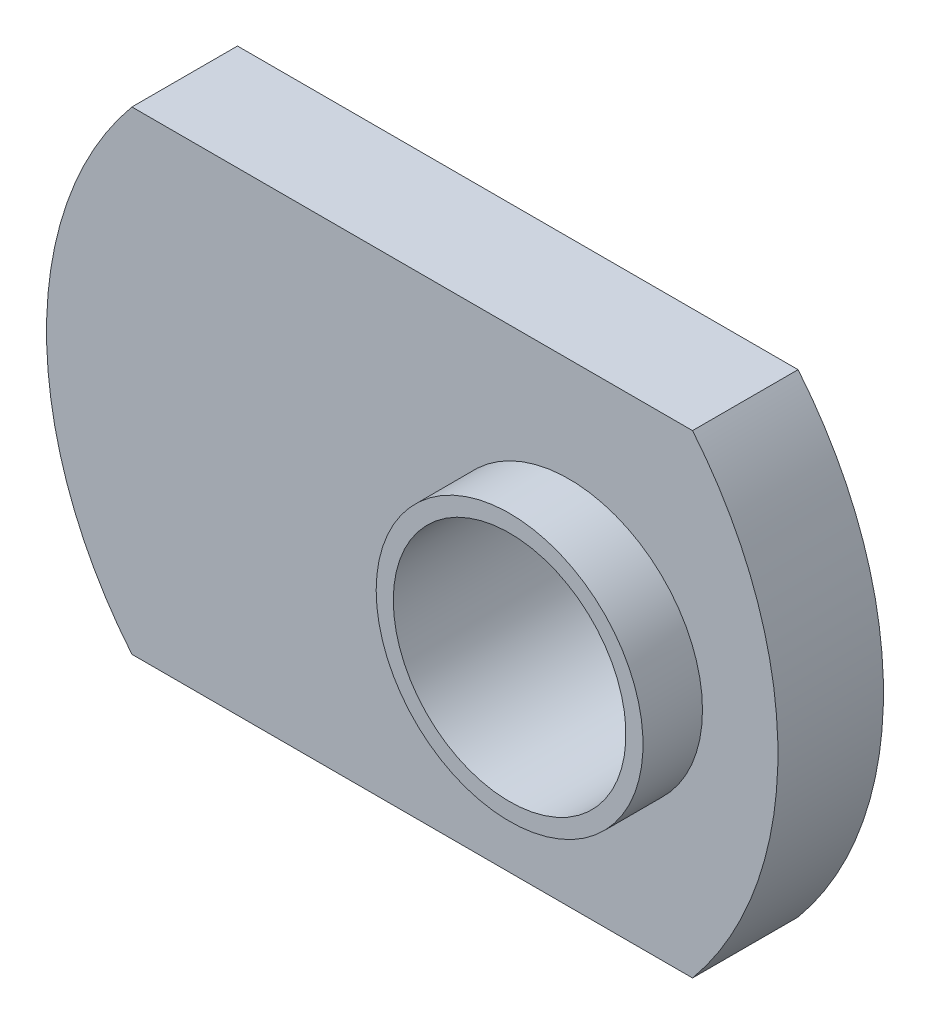
ISO-10303-21;
HEADER;
FILE_DESCRIPTION(('STEP AP214'),'2;1');
FILE_NAME('part.step','',(''),(''),'','','');
FILE_SCHEMA(('AUTOMOTIVE_DESIGN { 1 0 10303 214 1 1 1 1 }'));
ENDSEC;
DATA;
#1=APPLICATION_CONTEXT('core data for automotive mechanical design processes');
#2=APPLICATION_PROTOCOL_DEFINITION('international standard','automotive_design',2000,#1);
#3=PRODUCT_CONTEXT('',#1,'mechanical');
#4=PRODUCT('Part','Part','',(#3));
#5=PRODUCT_RELATED_PRODUCT_CATEGORY('part','',(#4));
#6=PRODUCT_DEFINITION_FORMATION('','',#4);
#7=PRODUCT_DEFINITION_CONTEXT('part definition',#1,'design');
#8=PRODUCT_DEFINITION('design','',#6,#7);
#9=PRODUCT_DEFINITION_SHAPE('','',#8);
#10=(LENGTH_UNIT() NAMED_UNIT(*) SI_UNIT(.MILLI.,.METRE.));
#11=(NAMED_UNIT(*) PLANE_ANGLE_UNIT() SI_UNIT($,.RADIAN.));
#12=(NAMED_UNIT(*) SI_UNIT($,.STERADIAN.) SOLID_ANGLE_UNIT());
#13=UNCERTAINTY_MEASURE_WITH_UNIT(LENGTH_MEASURE(1.E-05),#10,'distance_accuracy_value','');
#14=(GEOMETRIC_REPRESENTATION_CONTEXT(3) GLOBAL_UNCERTAINTY_ASSIGNED_CONTEXT((#13)) GLOBAL_UNIT_ASSIGNED_CONTEXT((#10,
#11,#12)) REPRESENTATION_CONTEXT('',''));
#15=CARTESIAN_POINT('',(0.,0.,0.));
#16=DIRECTION('',(0.,0.,1.));
#17=DIRECTION('',(1.,0.,0.));
#18=AXIS2_PLACEMENT_3D('',#15,#16,#17);
#19=CARTESIAN_POINT('',(112.122960264315,128.471327571716,0.));
#20=DIRECTION('',(0.,0.,1.));
#21=DIRECTION('',(1.,0.,0.));
#22=AXIS2_PLACEMENT_3D('',#19,#20,#21);
#23=CYLINDRICAL_SURFACE('',#22,12.7);
#24=CARTESIAN_POINT('',(112.122960264315,128.471327571716,3.6068));
#25=DIRECTION('',(0.,0.,1.));
#26=DIRECTION('',(1.,0.,0.));
#27=AXIS2_PLACEMENT_3D('',#24,#25,#26);
#28=CIRCLE('',#27,12.7);
#29=CARTESIAN_POINT('',(102.34139454116,136.571387571716,3.6068));
#30=VERTEX_POINT('',#29);
#31=CARTESIAN_POINT('',(102.34139454116,120.371267571716,3.6068));
#32=VERTEX_POINT('',#31);
#33=EDGE_CURVE('E105',#30,#32,#28,.T.);
#34=ORIENTED_EDGE('',*,*,#33,.F.);
#35=DIRECTION('',(0.,0.,1.));
#36=VECTOR('',#35,1.);
#37=CARTESIAN_POINT('',(102.34139454116,136.571387571716,0.));
#38=LINE('',#37,#36);
#39=CARTESIAN_POINT('',(102.34139454116,136.571387571716,0.));
#40=VERTEX_POINT('',#39);
#41=EDGE_CURVE('E46',#40,#30,#38,.T.);
#42=ORIENTED_EDGE('',*,*,#41,.F.);
#43=CARTESIAN_POINT('',(112.122960264315,128.471327571716,0.));
#44=DIRECTION('',(0.,0.,1.));
#45=DIRECTION('',(1.,0.,0.));
#46=AXIS2_PLACEMENT_3D('',#43,#44,#45);
#47=CIRCLE('',#46,12.7);
#48=CARTESIAN_POINT('',(102.34139454116,120.371267571716,0.));
#49=VERTEX_POINT('',#48);
#50=EDGE_CURVE('E98',#40,#49,#47,.T.);
#51=ORIENTED_EDGE('',*,*,#50,.T.);
#52=DIRECTION('',(0.,0.,1.));
#53=VECTOR('',#52,1.);
#54=CARTESIAN_POINT('',(102.34139454116,120.371267571716,0.));
#55=LINE('',#54,#53);
#56=EDGE_CURVE('E81',#49,#32,#55,.T.);
#57=ORIENTED_EDGE('',*,*,#56,.T.);
#58=EDGE_LOOP('',(#34,#42,#51,#57));
#59=FACE_BOUND('',#58,.T.);
#60=ADVANCED_FACE('F37',(#59),#23,.T.);
#61=CARTESIAN_POINT('',(121.49812598747,136.571387571716,0.));
#62=DIRECTION('',(0.,1.,0.));
#63=DIRECTION('',(0.,0.,1.));
#64=AXIS2_PLACEMENT_3D('',#61,#62,#63);
#65=PLANE('',#64);
#66=DIRECTION('',(-1.,0.,0.));
#67=VECTOR('',#66,1.);
#68=CARTESIAN_POINT('',(121.49812598747,136.571387571716,3.6068));
#69=LINE('',#68,#67);
#70=CARTESIAN_POINT('',(121.49812598747,136.571387571716,3.6068));
#71=VERTEX_POINT('',#70);
#72=EDGE_CURVE('E100',#71,#30,#69,.T.);
#73=ORIENTED_EDGE('',*,*,#72,.F.);
#74=DIRECTION('',(0.,0.,1.));
#75=VECTOR('',#74,1.);
#76=CARTESIAN_POINT('',(121.49812598747,136.571387571716,0.));
#77=LINE('',#76,#75);
#78=CARTESIAN_POINT('',(121.49812598747,136.571387571716,0.));
#79=VERTEX_POINT('',#78);
#80=EDGE_CURVE('E70',#79,#71,#77,.T.);
#81=ORIENTED_EDGE('',*,*,#80,.F.);
#82=DIRECTION('',(-1.,0.,0.));
#83=VECTOR('',#82,1.);
#84=CARTESIAN_POINT('',(121.49812598747,136.571387571716,0.));
#85=LINE('',#84,#83);
#86=EDGE_CURVE('E95',#79,#40,#85,.T.);
#87=ORIENTED_EDGE('',*,*,#86,.T.);
#88=ORIENTED_EDGE('',*,*,#41,.T.);
#89=EDGE_LOOP('',(#73,#81,#87,#88));
#90=FACE_BOUND('',#89,.T.);
#91=ADVANCED_FACE('F117',(#90),#65,.T.);
#92=CARTESIAN_POINT('',(111.716560264315,128.471327571716,0.));
#93=DIRECTION('',(0.,0.,1.));
#94=DIRECTION('',(1.,0.,0.));
#95=AXIS2_PLACEMENT_3D('',#92,#93,#94);
#96=CYLINDRICAL_SURFACE('',#95,12.7);
#97=CARTESIAN_POINT('',(111.716560264315,128.471327571716,3.6068));
#98=DIRECTION('',(0.,0.,1.));
#99=DIRECTION('',(1.,0.,0.));
#100=AXIS2_PLACEMENT_3D('',#97,#98,#99);
#101=CIRCLE('',#100,12.7);
#102=CARTESIAN_POINT('',(121.49812598747,120.371267571716,3.6068));
#103=VERTEX_POINT('',#102);
#104=EDGE_CURVE('E89',#103,#71,#101,.T.);
#105=ORIENTED_EDGE('',*,*,#104,.F.);
#106=DIRECTION('',(0.,0.,1.));
#107=VECTOR('',#106,1.);
#108=CARTESIAN_POINT('',(121.49812598747,120.371267571716,0.));
#109=LINE('',#108,#107);
#110=CARTESIAN_POINT('',(121.49812598747,120.371267571716,0.));
#111=VERTEX_POINT('',#110);
#112=EDGE_CURVE('E84',#111,#103,#109,.T.);
#113=ORIENTED_EDGE('',*,*,#112,.F.);
#114=CARTESIAN_POINT('',(111.716560264315,128.471327571716,0.));
#115=DIRECTION('',(0.,0.,1.));
#116=DIRECTION('',(1.,0.,0.));
#117=AXIS2_PLACEMENT_3D('',#114,#115,#116);
#118=CIRCLE('',#117,12.7);
#119=EDGE_CURVE('E87',#111,#79,#118,.T.);
#120=ORIENTED_EDGE('',*,*,#119,.T.);
#121=ORIENTED_EDGE('',*,*,#80,.T.);
#122=EDGE_LOOP('',(#105,#113,#120,#121));
#123=FACE_BOUND('',#122,.T.);
#124=ADVANCED_FACE('F86',(#123),#96,.T.);
#125=CARTESIAN_POINT('',(102.34139454116,120.371267571716,0.));
#126=DIRECTION('',(0.,-1.,0.));
#127=DIRECTION('',(0.,0.,-1.));
#128=AXIS2_PLACEMENT_3D('',#125,#126,#127);
#129=PLANE('',#128);
#130=DIRECTION('',(1.,0.,0.));
#131=VECTOR('',#130,1.);
#132=CARTESIAN_POINT('',(102.34139454116,120.371267571716,3.6068));
#133=LINE('',#132,#131);
#134=EDGE_CURVE('E108',#32,#103,#133,.T.);
#135=ORIENTED_EDGE('',*,*,#134,.F.);
#136=ORIENTED_EDGE('',*,*,#56,.F.);
#137=DIRECTION('',(1.,0.,0.));
#138=VECTOR('',#137,1.);
#139=CARTESIAN_POINT('',(102.34139454116,120.371267571716,0.));
#140=LINE('',#139,#138);
#141=EDGE_CURVE('E94',#49,#111,#140,.T.);
#142=ORIENTED_EDGE('',*,*,#141,.T.);
#143=ORIENTED_EDGE('',*,*,#112,.T.);
#144=EDGE_LOOP('',(#135,#136,#142,#143));
#145=FACE_BOUND('',#144,.T.);
#146=ADVANCED_FACE('F97',(#145),#129,.T.);
#147=CARTESIAN_POINT('',(112.122960264315,128.471327571716,0.));
#148=DIRECTION('',(0.,0.,1.));
#149=DIRECTION('',(1.,0.,0.));
#150=AXIS2_PLACEMENT_3D('',#147,#148,#149);
#151=PLANE('',#150);
#152=CARTESIAN_POINT('',(117.279160264315,128.471327571716,0.));
#153=DIRECTION('',(0.,0.,-1.));
#154=DIRECTION('',(-1.,0.,0.));
#155=AXIS2_PLACEMENT_3D('',#152,#153,#154);
#156=CIRCLE('',#155,3.97509999999998);
#157=CARTESIAN_POINT('',(113.304060264315,128.471327571716,0.));
#158=VERTEX_POINT('',#157);
#159=EDGE_CURVE('E156',#158,#158,#156,.T.);
#160=ORIENTED_EDGE('',*,*,#159,.F.);
#161=EDGE_LOOP('',(#160));
#162=FACE_BOUND('',#161,.T.);
#163=ORIENTED_EDGE('',*,*,#50,.F.);
#164=ORIENTED_EDGE('',*,*,#86,.F.);
#165=ORIENTED_EDGE('',*,*,#119,.F.);
#166=ORIENTED_EDGE('',*,*,#141,.F.);
#167=EDGE_LOOP('',(#163,#164,#165,#166));
#168=FACE_BOUND('',#167,.T.);
#169=ADVANCED_FACE('F93',(#162,#168),#151,.F.);
#170=CARTESIAN_POINT('',(112.122960264315,128.471327571716,3.6068));
#171=DIRECTION('',(0.,0.,1.));
#172=DIRECTION('',(1.,0.,0.));
#173=AXIS2_PLACEMENT_3D('',#170,#171,#172);
#174=PLANE('',#173);
#175=CARTESIAN_POINT('',(117.279160264315,128.471327571716,3.6068));
#176=DIRECTION('',(0.,0.,1.));
#177=DIRECTION('',(1.,0.,0.));
#178=AXIS2_PLACEMENT_3D('',#175,#176,#177);
#179=CIRCLE('',#178,4.5593);
#180=CARTESIAN_POINT('',(121.838460264315,128.471327571716,3.6068));
#181=VERTEX_POINT('',#180);
#182=EDGE_CURVE('E11',#181,#181,#179,.T.);
#183=ORIENTED_EDGE('',*,*,#182,.F.);
#184=EDGE_LOOP('',(#183));
#185=FACE_BOUND('',#184,.T.);
#186=ORIENTED_EDGE('',*,*,#33,.T.);
#187=ORIENTED_EDGE('',*,*,#134,.T.);
#188=ORIENTED_EDGE('',*,*,#104,.T.);
#189=ORIENTED_EDGE('',*,*,#72,.T.);
#190=EDGE_LOOP('',(#186,#187,#188,#189));
#191=FACE_BOUND('',#190,.T.);
#192=ADVANCED_FACE('F116',(#185,#191),#174,.T.);
#193=CARTESIAN_POINT('',(117.279160264315,128.471327571716,5.6388));
#194=DIRECTION('',(0.,0.,-1.));
#195=DIRECTION('',(-1.,0.,0.));
#196=AXIS2_PLACEMENT_3D('',#193,#194,#195);
#197=CYLINDRICAL_SURFACE('',#196,4.5593);
#198=CARTESIAN_POINT('',(117.279160264315,128.471327571716,5.6388));
#199=DIRECTION('',(0.,0.,-1.));
#200=DIRECTION('',(-1.,0.,0.));
#201=AXIS2_PLACEMENT_3D('',#198,#199,#200);
#202=CIRCLE('',#201,4.5593);
#203=CARTESIAN_POINT('',(112.719860264315,128.471327571716,5.6388));
#204=VERTEX_POINT('',#203);
#205=EDGE_CURVE('E109',#204,#204,#202,.T.);
#206=ORIENTED_EDGE('',*,*,#205,.T.);
#207=EDGE_LOOP('',(#206));
#208=FACE_BOUND('',#207,.T.);
#209=ORIENTED_EDGE('',*,*,#182,.T.);
#210=EDGE_LOOP('',(#209));
#211=FACE_BOUND('',#210,.T.);
#212=ADVANCED_FACE('F135',(#208,#211),#197,.T.);
#213=CARTESIAN_POINT('',(121.838460264315,128.471327571716,5.6388));
#214=DIRECTION('',(0.,0.,1.));
#215=DIRECTION('',(1.,0.,0.));
#216=AXIS2_PLACEMENT_3D('',#213,#214,#215);
#217=PLANE('',#216);
#218=CARTESIAN_POINT('',(117.279160264315,128.471327571716,5.6388));
#219=DIRECTION('',(0.,0.,-1.));
#220=DIRECTION('',(-1.,0.,0.));
#221=AXIS2_PLACEMENT_3D('',#218,#219,#220);
#222=CIRCLE('',#221,3.97509999999998);
#223=CARTESIAN_POINT('',(113.304060264315,128.471327571716,5.6388));
#224=VERTEX_POINT('',#223);
#225=EDGE_CURVE('E154',#224,#224,#222,.T.);
#226=ORIENTED_EDGE('',*,*,#225,.T.);
#227=EDGE_LOOP('',(#226));
#228=FACE_BOUND('',#227,.T.);
#229=ORIENTED_EDGE('',*,*,#205,.F.);
#230=EDGE_LOOP('',(#229));
#231=FACE_BOUND('',#230,.T.);
#232=ADVANCED_FACE('F141',(#228,#231),#217,.T.);
#233=CARTESIAN_POINT('',(117.279160264315,128.471327571716,0.));
#234=DIRECTION('',(0.,0.,-1.));
#235=DIRECTION('',(-1.,0.,0.));
#236=AXIS2_PLACEMENT_3D('',#233,#234,#235);
#237=CYLINDRICAL_SURFACE('',#236,3.97509999999998);
#238=ORIENTED_EDGE('',*,*,#225,.F.);
#239=EDGE_LOOP('',(#238));
#240=FACE_BOUND('',#239,.T.);
#241=ORIENTED_EDGE('',*,*,#159,.T.);
#242=EDGE_LOOP('',(#241));
#243=FACE_BOUND('',#242,.T.);
#244=ADVANCED_FACE('F145',(#240,#243),#237,.F.);
#245=CLOSED_SHELL('',(#60,#91,#124,#146,#169,#192,#212,#232,#244));
#246=MANIFOLD_SOLID_BREP('B2',#245);
#247=ADVANCED_BREP_SHAPE_REPRESENTATION('',(#18,#246),#14);
#248=SHAPE_DEFINITION_REPRESENTATION(#9,#247);
ENDSEC;
END-ISO-10303-21;
